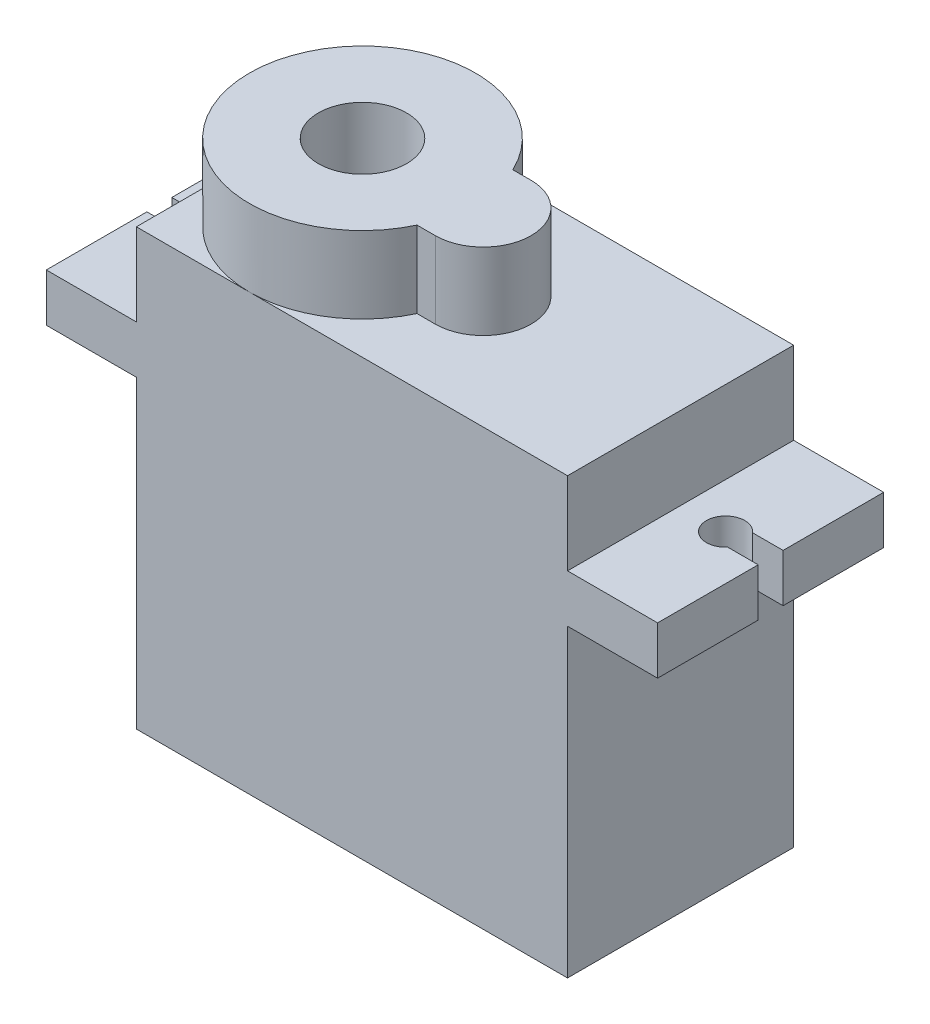
ISO-10303-21;
HEADER;
FILE_DESCRIPTION(('STEP AP214'),'2;1');
FILE_NAME('part.step','',(''),(''),'','','');
FILE_SCHEMA(('AUTOMOTIVE_DESIGN { 1 0 10303 214 1 1 1 1 }'));
ENDSEC;
DATA;
#1=APPLICATION_CONTEXT('core data for automotive mechanical design processes');
#2=APPLICATION_PROTOCOL_DEFINITION('international standard','automotive_design',2000,#1);
#3=PRODUCT_CONTEXT('',#1,'mechanical');
#4=PRODUCT('Part','Part','',(#3));
#5=PRODUCT_RELATED_PRODUCT_CATEGORY('part','',(#4));
#6=PRODUCT_DEFINITION_FORMATION('','',#4);
#7=PRODUCT_DEFINITION_CONTEXT('part definition',#1,'design');
#8=PRODUCT_DEFINITION('design','',#6,#7);
#9=PRODUCT_DEFINITION_SHAPE('','',#8);
#10=(LENGTH_UNIT() NAMED_UNIT(*) SI_UNIT(.MILLI.,.METRE.));
#11=(NAMED_UNIT(*) PLANE_ANGLE_UNIT() SI_UNIT($,.RADIAN.));
#12=(NAMED_UNIT(*) SI_UNIT($,.STERADIAN.) SOLID_ANGLE_UNIT());
#13=UNCERTAINTY_MEASURE_WITH_UNIT(LENGTH_MEASURE(1.E-05),#10,'distance_accuracy_value','');
#14=(GEOMETRIC_REPRESENTATION_CONTEXT(3) GLOBAL_UNCERTAINTY_ASSIGNED_CONTEXT((#13)) GLOBAL_UNIT_ASSIGNED_CONTEXT((#10,
#11,#12)) REPRESENTATION_CONTEXT('',''));
#15=CARTESIAN_POINT('',(0.,0.,0.));
#16=DIRECTION('',(0.,0.,1.));
#17=DIRECTION('',(1.,0.,0.));
#18=AXIS2_PLACEMENT_3D('',#15,#16,#17);
#19=CARTESIAN_POINT('',(22.5,15.9,11.8));
#20=DIRECTION('',(0.,1.,0.));
#21=DIRECTION('',(-1.,0.,0.));
#22=AXIS2_PLACEMENT_3D('',#19,#20,#21);
#23=PLANE('',#22);
#24=DIRECTION('',(1.,0.,0.));
#25=VECTOR('',#24,1.);
#26=CARTESIAN_POINT('',(22.5,15.9,5.25));
#27=LINE('',#26,#25);
#28=CARTESIAN_POINT('',(25.6099342076785,15.9,5.25));
#29=VERTEX_POINT('',#28);
#30=CARTESIAN_POINT('',(27.2,15.9,5.25));
#31=VERTEX_POINT('',#30);
#32=EDGE_CURVE('E443',#29,#31,#27,.T.);
#33=ORIENTED_EDGE('',*,*,#32,.F.);
#34=CARTESIAN_POINT('',(24.85,15.9,5.9));
#35=DIRECTION('',(0.,1.,0.));
#36=DIRECTION('',(-1.,0.,0.));
#37=AXIS2_PLACEMENT_3D('',#34,#35,#36);
#38=CIRCLE('',#37,1.);
#39=CARTESIAN_POINT('',(25.6099342076785,15.9,6.55));
#40=VERTEX_POINT('',#39);
#41=EDGE_CURVE('E442',#40,#29,#38,.F.);
#42=ORIENTED_EDGE('',*,*,#41,.F.);
#43=DIRECTION('',(-1.,0.,0.));
#44=VECTOR('',#43,1.);
#45=CARTESIAN_POINT('',(22.5,15.9,6.55));
#46=LINE('',#45,#44);
#47=CARTESIAN_POINT('',(27.2,15.9,6.55));
#48=VERTEX_POINT('',#47);
#49=EDGE_CURVE('E441',#48,#40,#46,.T.);
#50=ORIENTED_EDGE('',*,*,#49,.F.);
#51=DIRECTION('',(0.,0.,-1.));
#52=VECTOR('',#51,1.);
#53=CARTESIAN_POINT('',(27.2,15.9,11.8));
#54=LINE('',#53,#52);
#55=CARTESIAN_POINT('',(27.2,15.9,11.8));
#56=VERTEX_POINT('',#55);
#57=EDGE_CURVE('E220',#56,#48,#54,.T.);
#58=ORIENTED_EDGE('',*,*,#57,.F.);
#59=DIRECTION('',(1.,0.,0.));
#60=VECTOR('',#59,1.);
#61=CARTESIAN_POINT('',(22.5,15.9,11.8));
#62=LINE('',#61,#60);
#63=CARTESIAN_POINT('',(22.5,15.9,11.8));
#64=VERTEX_POINT('',#63);
#65=EDGE_CURVE('E322',#64,#56,#62,.T.);
#66=ORIENTED_EDGE('',*,*,#65,.F.);
#67=DIRECTION('',(0.,0.,-1.));
#68=VECTOR('',#67,1.);
#69=CARTESIAN_POINT('',(22.5,15.9,11.8));
#70=LINE('',#69,#68);
#71=CARTESIAN_POINT('',(22.5,15.9,0.));
#72=VERTEX_POINT('',#71);
#73=EDGE_CURVE('E235',#64,#72,#70,.T.);
#74=ORIENTED_EDGE('',*,*,#73,.T.);
#75=DIRECTION('',(1.,0.,0.));
#76=VECTOR('',#75,1.);
#77=CARTESIAN_POINT('',(22.5,15.9,0.));
#78=LINE('',#77,#76);
#79=CARTESIAN_POINT('',(27.2,15.9,0.));
#80=VERTEX_POINT('',#79);
#81=EDGE_CURVE('E348',#72,#80,#78,.T.);
#82=ORIENTED_EDGE('',*,*,#81,.T.);
#83=EDGE_CURVE('E227',#31,#80,#54,.T.);
#84=ORIENTED_EDGE('',*,*,#83,.F.);
#85=EDGE_LOOP('',(#33,#42,#50,#58,#66,#74,#82,#84));
#86=FACE_BOUND('',#85,.T.);
#87=ADVANCED_FACE('F32',(#86),#23,.F.);
#88=CARTESIAN_POINT('',(27.2,15.9,11.8));
#89=DIRECTION('',(-1.,0.,0.));
#90=DIRECTION('',(0.,-1.,0.));
#91=AXIS2_PLACEMENT_3D('',#88,#89,#90);
#92=PLANE('',#91);
#93=DIRECTION('',(0.,1.,0.));
#94=VECTOR('',#93,1.);
#95=CARTESIAN_POINT('',(27.2,14.4,5.25));
#96=LINE('',#95,#94);
#97=CARTESIAN_POINT('',(27.2,18.4,5.25));
#98=VERTEX_POINT('',#97);
#99=EDGE_CURVE('E221',#31,#98,#96,.T.);
#100=ORIENTED_EDGE('',*,*,#99,.F.);
#101=ORIENTED_EDGE('',*,*,#83,.T.);
#102=DIRECTION('',(0.,1.,0.));
#103=VECTOR('',#102,1.);
#104=CARTESIAN_POINT('',(27.2,15.9,0.));
#105=LINE('',#104,#103);
#106=CARTESIAN_POINT('',(27.2,18.4,0.));
#107=VERTEX_POINT('',#106);
#108=EDGE_CURVE('E351',#80,#107,#105,.T.);
#109=ORIENTED_EDGE('',*,*,#108,.T.);
#110=DIRECTION('',(0.,0.,-1.));
#111=VECTOR('',#110,1.);
#112=CARTESIAN_POINT('',(27.2,18.4,11.8));
#113=LINE('',#112,#111);
#114=EDGE_CURVE('E228',#98,#107,#113,.T.);
#115=ORIENTED_EDGE('',*,*,#114,.F.);
#116=EDGE_LOOP('',(#100,#101,#109,#115));
#117=FACE_BOUND('',#116,.T.);
#118=ADVANCED_FACE('F491',(#117),#92,.F.);
#119=DIRECTION('',(0.,1.,0.));
#120=VECTOR('',#119,1.);
#121=CARTESIAN_POINT('',(27.2,14.4,6.55));
#122=LINE('',#121,#120);
#123=CARTESIAN_POINT('',(27.2,18.4,6.55));
#124=VERTEX_POINT('',#123);
#125=EDGE_CURVE('E205',#48,#124,#122,.T.);
#126=ORIENTED_EDGE('',*,*,#125,.T.);
#127=CARTESIAN_POINT('',(27.2,18.4,11.8));
#128=VERTEX_POINT('',#127);
#129=EDGE_CURVE('E217',#128,#124,#113,.T.);
#130=ORIENTED_EDGE('',*,*,#129,.F.);
#131=DIRECTION('',(0.,1.,0.));
#132=VECTOR('',#131,1.);
#133=CARTESIAN_POINT('',(27.2,15.9,11.8));
#134=LINE('',#133,#132);
#135=EDGE_CURVE('E324',#56,#128,#134,.T.);
#136=ORIENTED_EDGE('',*,*,#135,.F.);
#137=ORIENTED_EDGE('',*,*,#57,.T.);
#138=EDGE_LOOP('',(#126,#130,#136,#137));
#139=FACE_BOUND('',#138,.T.);
#140=ADVANCED_FACE('F215',(#139),#92,.F.);
#141=CARTESIAN_POINT('',(22.5,18.4,11.8));
#142=DIRECTION('',(0.,-1.,0.));
#143=DIRECTION('',(0.,0.,-1.));
#144=AXIS2_PLACEMENT_3D('',#141,#142,#143);
#145=PLANE('',#144);
#146=DIRECTION('',(1.,0.,0.));
#147=VECTOR('',#146,1.);
#148=CARTESIAN_POINT('',(27.2,18.4,5.25));
#149=LINE('',#148,#147);
#150=CARTESIAN_POINT('',(25.6099342076785,18.4,5.25));
#151=VERTEX_POINT('',#150);
#152=EDGE_CURVE('E210',#151,#98,#149,.T.);
#153=ORIENTED_EDGE('',*,*,#152,.T.);
#154=ORIENTED_EDGE('',*,*,#114,.T.);
#155=DIRECTION('',(-1.,0.,0.));
#156=VECTOR('',#155,1.);
#157=CARTESIAN_POINT('',(22.5,18.4,0.));
#158=LINE('',#157,#156);
#159=CARTESIAN_POINT('',(22.5,18.4,0.));
#160=VERTEX_POINT('',#159);
#161=EDGE_CURVE('E354',#107,#160,#158,.T.);
#162=ORIENTED_EDGE('',*,*,#161,.T.);
#163=DIRECTION('',(0.,0.,-1.));
#164=VECTOR('',#163,1.);
#165=CARTESIAN_POINT('',(22.5,18.4,11.8));
#166=LINE('',#165,#164);
#167=CARTESIAN_POINT('',(22.5,18.4,11.8));
#168=VERTEX_POINT('',#167);
#169=EDGE_CURVE('E231',#168,#160,#166,.T.);
#170=ORIENTED_EDGE('',*,*,#169,.F.);
#171=DIRECTION('',(-1.,0.,0.));
#172=VECTOR('',#171,1.);
#173=CARTESIAN_POINT('',(22.5,18.4,11.8));
#174=LINE('',#173,#172);
#175=EDGE_CURVE('E226',#128,#168,#174,.T.);
#176=ORIENTED_EDGE('',*,*,#175,.F.);
#177=ORIENTED_EDGE('',*,*,#129,.T.);
#178=DIRECTION('',(-1.,0.,0.));
#179=VECTOR('',#178,1.);
#180=CARTESIAN_POINT('',(27.2,18.4,6.55));
#181=LINE('',#180,#179);
#182=CARTESIAN_POINT('',(25.6099342076785,18.4,6.55));
#183=VERTEX_POINT('',#182);
#184=EDGE_CURVE('E202',#124,#183,#181,.T.);
#185=ORIENTED_EDGE('',*,*,#184,.T.);
#186=CARTESIAN_POINT('',(24.85,18.4,5.9));
#187=DIRECTION('',(0.,-1.,0.));
#188=DIRECTION('',(0.,0.,1.));
#189=AXIS2_PLACEMENT_3D('',#186,#187,#188);
#190=CIRCLE('',#189,1.);
#191=EDGE_CURVE('E47',#183,#151,#190,.T.);
#192=ORIENTED_EDGE('',*,*,#191,.T.);
#193=EDGE_LOOP('',(#153,#154,#162,#170,#176,#177,#185,#192));
#194=FACE_BOUND('',#193,.T.);
#195=ADVANCED_FACE('F224',(#194),#145,.F.);
#196=CARTESIAN_POINT('',(-4.7,15.9,11.8));
#197=DIRECTION('',(1.,0.,0.));
#198=DIRECTION('',(0.,0.,-1.));
#199=AXIS2_PLACEMENT_3D('',#196,#197,#198);
#200=PLANE('',#199);
#201=DIRECTION('',(0.,0.,-1.));
#202=VECTOR('',#201,1.);
#203=CARTESIAN_POINT('',(-4.7,18.4,11.8));
#204=LINE('',#203,#202);
#205=CARTESIAN_POINT('',(-4.7,18.4,11.8));
#206=VERTEX_POINT('',#205);
#207=CARTESIAN_POINT('',(-4.7,18.4,6.55));
#208=VERTEX_POINT('',#207);
#209=EDGE_CURVE('E377',#206,#208,#204,.T.);
#210=ORIENTED_EDGE('',*,*,#209,.T.);
#211=DIRECTION('',(0.,1.,0.));
#212=VECTOR('',#211,1.);
#213=CARTESIAN_POINT('',(-4.7,14.4,6.55));
#214=LINE('',#213,#212);
#215=CARTESIAN_POINT('',(-4.7,15.9,6.55));
#216=VERTEX_POINT('',#215);
#217=EDGE_CURVE('E267',#216,#208,#214,.T.);
#218=ORIENTED_EDGE('',*,*,#217,.F.);
#219=DIRECTION('',(0.,0.,-1.));
#220=VECTOR('',#219,1.);
#221=CARTESIAN_POINT('',(-4.7,15.9,11.8));
#222=LINE('',#221,#220);
#223=CARTESIAN_POINT('',(-4.7,15.9,11.8));
#224=VERTEX_POINT('',#223);
#225=EDGE_CURVE('E374',#224,#216,#222,.T.);
#226=ORIENTED_EDGE('',*,*,#225,.F.);
#227=DIRECTION('',(0.,-1.,0.));
#228=VECTOR('',#227,1.);
#229=CARTESIAN_POINT('',(-4.7,15.9,11.8));
#230=LINE('',#229,#228);
#231=EDGE_CURVE('E337',#206,#224,#230,.T.);
#232=ORIENTED_EDGE('',*,*,#231,.F.);
#233=EDGE_LOOP('',(#210,#218,#226,#232));
#234=FACE_BOUND('',#233,.T.);
#235=ADVANCED_FACE('F474',(#234),#200,.F.);
#236=CARTESIAN_POINT('',(0.,22.7,11.8));
#237=DIRECTION('',(0.,-1.,0.));
#238=DIRECTION('',(0.,0.,-1.));
#239=AXIS2_PLACEMENT_3D('',#236,#237,#238);
#240=PLANE('',#239);
#241=CARTESIAN_POINT('',(5.9,22.7,5.9));
#242=DIRECTION('',(0.,1.,0.));
#243=DIRECTION('',(0.,0.,1.));
#244=AXIS2_PLACEMENT_3D('',#241,#242,#243);
#245=CIRCLE('',#244,5.9);
#246=CARTESIAN_POINT('',(0.,22.7,5.9));
#247=VERTEX_POINT('',#246);
#248=CARTESIAN_POINT('',(5.9,22.7,11.8));
#249=VERTEX_POINT('',#248);
#250=EDGE_CURVE('E246',#247,#249,#245,.T.);
#251=ORIENTED_EDGE('',*,*,#250,.F.);
#252=DIRECTION('',(0.,0.,-1.));
#253=VECTOR('',#252,1.);
#254=CARTESIAN_POINT('',(0.,22.7,11.8));
#255=LINE('',#254,#253);
#256=CARTESIAN_POINT('',(0.,22.7,11.8));
#257=VERTEX_POINT('',#256);
#258=EDGE_CURVE('E384',#257,#247,#255,.T.);
#259=ORIENTED_EDGE('',*,*,#258,.F.);
#260=DIRECTION('',(-1.,0.,0.));
#261=VECTOR('',#260,1.);
#262=CARTESIAN_POINT('',(0.,22.7,11.8));
#263=LINE('',#262,#261);
#264=EDGE_CURVE('E329',#249,#257,#263,.T.);
#265=ORIENTED_EDGE('',*,*,#264,.F.);
#266=EDGE_LOOP('',(#251,#259,#265));
#267=FACE_BOUND('',#266,.T.);
#268=ADVANCED_FACE('F430',(#267),#240,.F.);
#269=CARTESIAN_POINT('',(11.244155686355,22.7,8.4));
#270=VERTEX_POINT('',#269);
#271=EDGE_CURVE('E426',#249,#270,#245,.T.);
#272=ORIENTED_EDGE('',*,*,#271,.F.);
#273=CARTESIAN_POINT('',(22.5,22.7,11.8));
#274=VERTEX_POINT('',#273);
#275=EDGE_CURVE('E330',#274,#249,#263,.T.);
#276=ORIENTED_EDGE('',*,*,#275,.F.);
#277=DIRECTION('',(0.,0.,-1.));
#278=VECTOR('',#277,1.);
#279=CARTESIAN_POINT('',(22.5,22.7,11.8));
#280=LINE('',#279,#278);
#281=CARTESIAN_POINT('',(22.5,22.7,0.));
#282=VERTEX_POINT('',#281);
#283=EDGE_CURVE('E386',#274,#282,#280,.T.);
#284=ORIENTED_EDGE('',*,*,#283,.T.);
#285=DIRECTION('',(-1.,0.,0.));
#286=VECTOR('',#285,1.);
#287=CARTESIAN_POINT('',(0.,22.7,0.));
#288=LINE('',#287,#286);
#289=CARTESIAN_POINT('',(5.9,22.7,0.));
#290=VERTEX_POINT('',#289);
#291=EDGE_CURVE('E359',#282,#290,#288,.T.);
#292=ORIENTED_EDGE('',*,*,#291,.T.);
#293=CARTESIAN_POINT('',(11.244155686355,22.7,3.4));
#294=VERTEX_POINT('',#293);
#295=EDGE_CURVE('E297',#294,#290,#245,.T.);
#296=ORIENTED_EDGE('',*,*,#295,.F.);
#297=DIRECTION('',(-1.,0.,0.));
#298=VECTOR('',#297,1.);
#299=CARTESIAN_POINT('',(12.2,22.7,3.4));
#300=LINE('',#299,#298);
#301=CARTESIAN_POINT('',(12.2,22.7,3.4));
#302=VERTEX_POINT('',#301);
#303=EDGE_CURVE('E294',#302,#294,#300,.T.);
#304=ORIENTED_EDGE('',*,*,#303,.F.);
#305=CARTESIAN_POINT('',(12.2,22.7,5.9));
#306=DIRECTION('',(0.,1.,0.));
#307=DIRECTION('',(0.,0.,1.));
#308=AXIS2_PLACEMENT_3D('',#305,#306,#307);
#309=CIRCLE('',#308,2.5);
#310=CARTESIAN_POINT('',(12.2,22.7,8.4));
#311=VERTEX_POINT('',#310);
#312=EDGE_CURVE('E279',#311,#302,#309,.T.);
#313=ORIENTED_EDGE('',*,*,#312,.F.);
#314=DIRECTION('',(1.,0.,0.));
#315=VECTOR('',#314,1.);
#316=CARTESIAN_POINT('',(12.2,22.7,8.4));
#317=LINE('',#316,#315);
#318=EDGE_CURVE('E285',#270,#311,#317,.T.);
#319=ORIENTED_EDGE('',*,*,#318,.F.);
#320=EDGE_LOOP('',(#272,#276,#284,#292,#296,#304,#313,#319));
#321=FACE_BOUND('',#320,.T.);
#322=ADVANCED_FACE('F405',(#321),#240,.F.);
#323=EDGE_CURVE('E244',#290,#247,#245,.T.);
#324=ORIENTED_EDGE('',*,*,#323,.F.);
#325=CARTESIAN_POINT('',(0.,22.7,0.));
#326=VERTEX_POINT('',#325);
#327=EDGE_CURVE('E358',#290,#326,#288,.T.);
#328=ORIENTED_EDGE('',*,*,#327,.T.);
#329=EDGE_CURVE('E383',#247,#326,#255,.T.);
#330=ORIENTED_EDGE('',*,*,#329,.F.);
#331=EDGE_LOOP('',(#324,#328,#330));
#332=FACE_BOUND('',#331,.T.);
#333=ADVANCED_FACE('F479',(#332),#240,.F.);
#334=CARTESIAN_POINT('',(0.,0.,11.8));
#335=DIRECTION('',(1.,0.,0.));
#336=DIRECTION('',(0.,0.,-1.));
#337=AXIS2_PLACEMENT_3D('',#334,#335,#336);
#338=PLANE('',#337);
#339=DIRECTION('',(0.,-1.,0.));
#340=VECTOR('',#339,1.);
#341=CARTESIAN_POINT('',(0.,0.,0.));
#342=LINE('',#341,#340);
#343=CARTESIAN_POINT('',(0.,15.9,0.));
#344=VERTEX_POINT('',#343);
#345=CARTESIAN_POINT('',(0.,0.,0.));
#346=VERTEX_POINT('',#345);
#347=EDGE_CURVE('E313',#344,#346,#342,.T.);
#348=ORIENTED_EDGE('',*,*,#347,.T.);
#349=DIRECTION('',(0.,0.,-1.));
#350=VECTOR('',#349,1.);
#351=CARTESIAN_POINT('',(0.,0.,11.8));
#352=LINE('',#351,#350);
#353=CARTESIAN_POINT('',(0.,0.,11.8));
#354=VERTEX_POINT('',#353);
#355=EDGE_CURVE('E241',#354,#346,#352,.T.);
#356=ORIENTED_EDGE('',*,*,#355,.F.);
#357=DIRECTION('',(0.,-1.,0.));
#358=VECTOR('',#357,1.);
#359=CARTESIAN_POINT('',(0.,0.,11.8));
#360=LINE('',#359,#358);
#361=CARTESIAN_POINT('',(0.,15.9,11.8));
#362=VERTEX_POINT('',#361);
#363=EDGE_CURVE('E314',#362,#354,#360,.T.);
#364=ORIENTED_EDGE('',*,*,#363,.F.);
#365=DIRECTION('',(0.,0.,-1.));
#366=VECTOR('',#365,1.);
#367=CARTESIAN_POINT('',(0.,15.9,11.8));
#368=LINE('',#367,#366);
#369=EDGE_CURVE('E341',#362,#344,#368,.T.);
#370=ORIENTED_EDGE('',*,*,#369,.T.);
#371=EDGE_LOOP('',(#348,#356,#364,#370));
#372=FACE_BOUND('',#371,.T.);
#373=ADVANCED_FACE('F34',(#372),#338,.F.);
#374=CARTESIAN_POINT('',(0.,0.,11.8));
#375=DIRECTION('',(0.,1.,0.));
#376=DIRECTION('',(0.,0.,1.));
#377=AXIS2_PLACEMENT_3D('',#374,#375,#376);
#378=PLANE('',#377);
#379=DIRECTION('',(1.,0.,0.));
#380=VECTOR('',#379,1.);
#381=CARTESIAN_POINT('',(0.,0.,0.));
#382=LINE('',#381,#380);
#383=CARTESIAN_POINT('',(22.5,0.,0.));
#384=VERTEX_POINT('',#383);
#385=EDGE_CURVE('E344',#346,#384,#382,.T.);
#386=ORIENTED_EDGE('',*,*,#385,.T.);
#387=DIRECTION('',(0.,0.,-1.));
#388=VECTOR('',#387,1.);
#389=CARTESIAN_POINT('',(22.5,0.,11.8));
#390=LINE('',#389,#388);
#391=CARTESIAN_POINT('',(22.5,0.,11.8));
#392=VERTEX_POINT('',#391);
#393=EDGE_CURVE('E238',#392,#384,#390,.T.);
#394=ORIENTED_EDGE('',*,*,#393,.F.);
#395=DIRECTION('',(1.,0.,0.));
#396=VECTOR('',#395,1.);
#397=CARTESIAN_POINT('',(0.,0.,11.8));
#398=LINE('',#397,#396);
#399=EDGE_CURVE('E317',#354,#392,#398,.T.);
#400=ORIENTED_EDGE('',*,*,#399,.F.);
#401=ORIENTED_EDGE('',*,*,#355,.T.);
#402=EDGE_LOOP('',(#386,#394,#400,#401));
#403=FACE_BOUND('',#402,.T.);
#404=ADVANCED_FACE('F486',(#403),#378,.F.);
#405=CARTESIAN_POINT('',(22.5,0.,11.8));
#406=DIRECTION('',(-1.,0.,0.));
#407=DIRECTION('',(0.,0.,1.));
#408=AXIS2_PLACEMENT_3D('',#405,#406,#407);
#409=PLANE('',#408);
#410=DIRECTION('',(0.,1.,0.));
#411=VECTOR('',#410,1.);
#412=CARTESIAN_POINT('',(22.5,0.,0.));
#413=LINE('',#412,#411);
#414=EDGE_CURVE('E346',#384,#72,#413,.T.);
#415=ORIENTED_EDGE('',*,*,#414,.T.);
#416=ORIENTED_EDGE('',*,*,#73,.F.);
#417=DIRECTION('',(0.,1.,0.));
#418=VECTOR('',#417,1.);
#419=CARTESIAN_POINT('',(22.5,0.,11.8));
#420=LINE('',#419,#418);
#421=EDGE_CURVE('E320',#392,#64,#420,.T.);
#422=ORIENTED_EDGE('',*,*,#421,.F.);
#423=ORIENTED_EDGE('',*,*,#393,.T.);
#424=EDGE_LOOP('',(#415,#416,#422,#423));
#425=FACE_BOUND('',#424,.T.);
#426=ADVANCED_FACE('F500',(#425),#409,.F.);
#427=CARTESIAN_POINT('',(22.5,18.4,11.8));
#428=DIRECTION('',(-1.,0.,0.));
#429=DIRECTION('',(0.,0.,1.));
#430=AXIS2_PLACEMENT_3D('',#427,#428,#429);
#431=PLANE('',#430);
#432=DIRECTION('',(0.,1.,0.));
#433=VECTOR('',#432,1.);
#434=CARTESIAN_POINT('',(22.5,18.4,0.));
#435=LINE('',#434,#433);
#436=EDGE_CURVE('E356',#160,#282,#435,.T.);
#437=ORIENTED_EDGE('',*,*,#436,.T.);
#438=ORIENTED_EDGE('',*,*,#283,.F.);
#439=DIRECTION('',(0.,1.,0.));
#440=VECTOR('',#439,1.);
#441=CARTESIAN_POINT('',(22.5,18.4,11.8));
#442=LINE('',#441,#440);
#443=EDGE_CURVE('E327',#168,#274,#442,.T.);
#444=ORIENTED_EDGE('',*,*,#443,.F.);
#445=ORIENTED_EDGE('',*,*,#169,.T.);
#446=EDGE_LOOP('',(#437,#438,#444,#445));
#447=FACE_BOUND('',#446,.T.);
#448=ADVANCED_FACE('F396',(#447),#431,.F.);
#449=CARTESIAN_POINT('',(0.,18.4,11.8));
#450=DIRECTION('',(1.,0.,0.));
#451=DIRECTION('',(0.,0.,-1.));
#452=AXIS2_PLACEMENT_3D('',#449,#450,#451);
#453=PLANE('',#452);
#454=DIRECTION('',(0.,-1.,0.));
#455=VECTOR('',#454,1.);
#456=CARTESIAN_POINT('',(0.,18.4,0.));
#457=LINE('',#456,#455);
#458=CARTESIAN_POINT('',(0.,18.4,0.));
#459=VERTEX_POINT('',#458);
#460=EDGE_CURVE('E362',#326,#459,#457,.T.);
#461=ORIENTED_EDGE('',*,*,#460,.T.);
#462=DIRECTION('',(0.,0.,-1.));
#463=VECTOR('',#462,1.);
#464=CARTESIAN_POINT('',(0.,18.4,11.8));
#465=LINE('',#464,#463);
#466=CARTESIAN_POINT('',(0.,18.4,11.8));
#467=VERTEX_POINT('',#466);
#468=EDGE_CURVE('E380',#467,#459,#465,.T.);
#469=ORIENTED_EDGE('',*,*,#468,.F.);
#470=DIRECTION('',(0.,-1.,0.));
#471=VECTOR('',#470,1.);
#472=CARTESIAN_POINT('',(0.,18.4,11.8));
#473=LINE('',#472,#471);
#474=EDGE_CURVE('E333',#257,#467,#473,.T.);
#475=ORIENTED_EDGE('',*,*,#474,.F.);
#476=ORIENTED_EDGE('',*,*,#258,.T.);
#477=ORIENTED_EDGE('',*,*,#329,.T.);
#478=EDGE_LOOP('',(#461,#469,#475,#476,#477));
#479=FACE_BOUND('',#478,.T.);
#480=ADVANCED_FACE('F477',(#479),#453,.F.);
#481=CARTESIAN_POINT('',(-4.7,18.4,11.8));
#482=DIRECTION('',(0.,-1.,0.));
#483=DIRECTION('',(0.,0.,-1.));
#484=AXIS2_PLACEMENT_3D('',#481,#482,#483);
#485=PLANE('',#484);
#486=CARTESIAN_POINT('',(-2.35,18.4,5.9));
#487=DIRECTION('',(0.,1.,0.));
#488=DIRECTION('',(0.,0.,1.));
#489=AXIS2_PLACEMENT_3D('',#486,#487,#488);
#490=CIRCLE('',#489,1.);
#491=CARTESIAN_POINT('',(-3.10993420767853,18.4,6.55));
#492=VERTEX_POINT('',#491);
#493=CARTESIAN_POINT('',(-3.10993420767853,18.4,5.25));
#494=VERTEX_POINT('',#493);
#495=EDGE_CURVE('E451',#492,#494,#490,.T.);
#496=ORIENTED_EDGE('',*,*,#495,.F.);
#497=DIRECTION('',(1.,0.,0.));
#498=VECTOR('',#497,1.);
#499=CARTESIAN_POINT('',(-4.7,18.4,6.55));
#500=LINE('',#499,#498);
#501=EDGE_CURVE('E264',#208,#492,#500,.T.);
#502=ORIENTED_EDGE('',*,*,#501,.F.);
#503=ORIENTED_EDGE('',*,*,#209,.F.);
#504=DIRECTION('',(-1.,0.,0.));
#505=VECTOR('',#504,1.);
#506=CARTESIAN_POINT('',(-4.7,18.4,11.8));
#507=LINE('',#506,#505);
#508=EDGE_CURVE('E335',#467,#206,#507,.T.);
#509=ORIENTED_EDGE('',*,*,#508,.F.);
#510=ORIENTED_EDGE('',*,*,#468,.T.);
#511=DIRECTION('',(-1.,0.,0.));
#512=VECTOR('',#511,1.);
#513=CARTESIAN_POINT('',(-4.7,18.4,0.));
#514=LINE('',#513,#512);
#515=CARTESIAN_POINT('',(-4.7,18.4,0.));
#516=VERTEX_POINT('',#515);
#517=EDGE_CURVE('E364',#459,#516,#514,.T.);
#518=ORIENTED_EDGE('',*,*,#517,.T.);
#519=CARTESIAN_POINT('',(-4.7,18.4,5.25));
#520=VERTEX_POINT('',#519);
#521=EDGE_CURVE('E376',#520,#516,#204,.T.);
#522=ORIENTED_EDGE('',*,*,#521,.F.);
#523=DIRECTION('',(-1.,0.,0.));
#524=VECTOR('',#523,1.);
#525=CARTESIAN_POINT('',(-4.7,18.4,5.25));
#526=LINE('',#525,#524);
#527=EDGE_CURVE('E452',#494,#520,#526,.T.);
#528=ORIENTED_EDGE('',*,*,#527,.F.);
#529=EDGE_LOOP('',(#496,#502,#503,#509,#510,#518,#522,#528));
#530=FACE_BOUND('',#529,.T.);
#531=ADVANCED_FACE('F459',(#530),#485,.F.);
#532=CARTESIAN_POINT('',(-4.7,15.9,5.25));
#533=VERTEX_POINT('',#532);
#534=CARTESIAN_POINT('',(-4.7,15.9,0.));
#535=VERTEX_POINT('',#534);
#536=EDGE_CURVE('E373',#533,#535,#222,.T.);
#537=ORIENTED_EDGE('',*,*,#536,.F.);
#538=DIRECTION('',(0.,1.,0.));
#539=VECTOR('',#538,1.);
#540=CARTESIAN_POINT('',(-4.7,14.4,5.25));
#541=LINE('',#540,#539);
#542=EDGE_CURVE('E55',#533,#520,#541,.T.);
#543=ORIENTED_EDGE('',*,*,#542,.T.);
#544=ORIENTED_EDGE('',*,*,#521,.T.);
#545=DIRECTION('',(0.,-1.,0.));
#546=VECTOR('',#545,1.);
#547=CARTESIAN_POINT('',(-4.7,15.9,0.));
#548=LINE('',#547,#546);
#549=EDGE_CURVE('E367',#516,#535,#548,.T.);
#550=ORIENTED_EDGE('',*,*,#549,.T.);
#551=EDGE_LOOP('',(#537,#543,#544,#550));
#552=FACE_BOUND('',#551,.T.);
#553=ADVANCED_FACE('F458',(#552),#200,.F.);
#554=CARTESIAN_POINT('',(-4.7,15.9,11.8));
#555=DIRECTION('',(0.,1.,0.));
#556=DIRECTION('',(0.,0.,1.));
#557=AXIS2_PLACEMENT_3D('',#554,#555,#556);
#558=PLANE('',#557);
#559=ORIENTED_EDGE('',*,*,#225,.T.);
#560=DIRECTION('',(1.,0.,0.));
#561=VECTOR('',#560,1.);
#562=CARTESIAN_POINT('',(-4.7,15.9,6.55));
#563=LINE('',#562,#561);
#564=CARTESIAN_POINT('',(-3.10993420767853,15.9,6.55));
#565=VERTEX_POINT('',#564);
#566=EDGE_CURVE('E11',#216,#565,#563,.T.);
#567=ORIENTED_EDGE('',*,*,#566,.T.);
#568=CARTESIAN_POINT('',(-2.35,15.9,5.9));
#569=DIRECTION('',(0.,1.,0.));
#570=DIRECTION('',(0.,0.,1.));
#571=AXIS2_PLACEMENT_3D('',#568,#569,#570);
#572=CIRCLE('',#571,1.);
#573=CARTESIAN_POINT('',(-3.10993420767853,15.9,5.25));
#574=VERTEX_POINT('',#573);
#575=EDGE_CURVE('E40',#565,#574,#572,.T.);
#576=ORIENTED_EDGE('',*,*,#575,.T.);
#577=DIRECTION('',(-1.,0.,0.));
#578=VECTOR('',#577,1.);
#579=CARTESIAN_POINT('',(-4.7,15.9,5.25));
#580=LINE('',#579,#578);
#581=EDGE_CURVE('E245',#574,#533,#580,.T.);
#582=ORIENTED_EDGE('',*,*,#581,.T.);
#583=ORIENTED_EDGE('',*,*,#536,.T.);
#584=DIRECTION('',(1.,0.,0.));
#585=VECTOR('',#584,1.);
#586=CARTESIAN_POINT('',(-4.7,15.9,0.));
#587=LINE('',#586,#585);
#588=EDGE_CURVE('E318',#535,#344,#587,.T.);
#589=ORIENTED_EDGE('',*,*,#588,.T.);
#590=ORIENTED_EDGE('',*,*,#369,.F.);
#591=DIRECTION('',(1.,0.,0.));
#592=VECTOR('',#591,1.);
#593=CARTESIAN_POINT('',(-4.7,15.9,11.8));
#594=LINE('',#593,#592);
#595=EDGE_CURVE('E339',#224,#362,#594,.T.);
#596=ORIENTED_EDGE('',*,*,#595,.F.);
#597=EDGE_LOOP('',(#559,#567,#576,#582,#583,#589,#590,#596));
#598=FACE_BOUND('',#597,.T.);
#599=ADVANCED_FACE('F250',(#598),#558,.F.);
#600=CARTESIAN_POINT('',(0.,0.,11.8));
#601=DIRECTION('',(0.,0.,-1.));
#602=DIRECTION('',(-1.,0.,0.));
#603=AXIS2_PLACEMENT_3D('',#600,#601,#602);
#604=PLANE('',#603);
#605=ORIENTED_EDGE('',*,*,#363,.T.);
#606=ORIENTED_EDGE('',*,*,#399,.T.);
#607=ORIENTED_EDGE('',*,*,#421,.T.);
#608=ORIENTED_EDGE('',*,*,#65,.T.);
#609=ORIENTED_EDGE('',*,*,#135,.T.);
#610=ORIENTED_EDGE('',*,*,#175,.T.);
#611=ORIENTED_EDGE('',*,*,#443,.T.);
#612=ORIENTED_EDGE('',*,*,#275,.T.);
#613=ORIENTED_EDGE('',*,*,#264,.T.);
#614=ORIENTED_EDGE('',*,*,#474,.T.);
#615=ORIENTED_EDGE('',*,*,#508,.T.);
#616=ORIENTED_EDGE('',*,*,#231,.T.);
#617=ORIENTED_EDGE('',*,*,#595,.T.);
#618=EDGE_LOOP('',(#605,#606,#607,#608,#609,#610,#611,#612,#613,#614,#615,#616,#617));
#619=FACE_BOUND('',#618,.T.);
#620=ADVANCED_FACE('F434',(#619),#604,.F.);
#621=CARTESIAN_POINT('',(0.,0.,0.));
#622=DIRECTION('',(0.,0.,-1.));
#623=DIRECTION('',(-1.,0.,0.));
#624=AXIS2_PLACEMENT_3D('',#621,#622,#623);
#625=PLANE('',#624);
#626=ORIENTED_EDGE('',*,*,#347,.F.);
#627=ORIENTED_EDGE('',*,*,#588,.F.);
#628=ORIENTED_EDGE('',*,*,#549,.F.);
#629=ORIENTED_EDGE('',*,*,#517,.F.);
#630=ORIENTED_EDGE('',*,*,#460,.F.);
#631=ORIENTED_EDGE('',*,*,#327,.F.);
#632=ORIENTED_EDGE('',*,*,#291,.F.);
#633=ORIENTED_EDGE('',*,*,#436,.F.);
#634=ORIENTED_EDGE('',*,*,#161,.F.);
#635=ORIENTED_EDGE('',*,*,#108,.F.);
#636=ORIENTED_EDGE('',*,*,#81,.F.);
#637=ORIENTED_EDGE('',*,*,#414,.F.);
#638=ORIENTED_EDGE('',*,*,#385,.F.);
#639=EDGE_LOOP('',(#626,#627,#628,#629,#630,#631,#632,#633,#634,#635,#636,#637,#638));
#640=FACE_BOUND('',#639,.T.);
#641=ADVANCED_FACE('F400',(#640),#625,.T.);
#642=CARTESIAN_POINT('',(12.2,26.7,5.9));
#643=DIRECTION('',(0.,-1.,0.));
#644=DIRECTION('',(0.,0.,-1.));
#645=AXIS2_PLACEMENT_3D('',#642,#643,#644);
#646=CYLINDRICAL_SURFACE('',#645,2.5);
#647=ORIENTED_EDGE('',*,*,#312,.T.);
#648=DIRECTION('',(0.,-1.,0.));
#649=VECTOR('',#648,1.);
#650=CARTESIAN_POINT('',(12.2,26.7,3.4));
#651=LINE('',#650,#649);
#652=CARTESIAN_POINT('',(12.2,26.7,3.4));
#653=VERTEX_POINT('',#652);
#654=EDGE_CURVE('E310',#653,#302,#651,.T.);
#655=ORIENTED_EDGE('',*,*,#654,.F.);
#656=CARTESIAN_POINT('',(12.2,26.7,5.9));
#657=DIRECTION('',(0.,1.,0.));
#658=DIRECTION('',(0.,0.,1.));
#659=AXIS2_PLACEMENT_3D('',#656,#657,#658);
#660=CIRCLE('',#659,2.5);
#661=CARTESIAN_POINT('',(12.2,26.7,8.4));
#662=VERTEX_POINT('',#661);
#663=EDGE_CURVE('E281',#662,#653,#660,.T.);
#664=ORIENTED_EDGE('',*,*,#663,.F.);
#665=DIRECTION('',(0.,-1.,0.));
#666=VECTOR('',#665,1.);
#667=CARTESIAN_POINT('',(12.2,26.7,8.4));
#668=LINE('',#667,#666);
#669=EDGE_CURVE('E291',#662,#311,#668,.T.);
#670=ORIENTED_EDGE('',*,*,#669,.T.);
#671=EDGE_LOOP('',(#647,#655,#664,#670));
#672=FACE_BOUND('',#671,.T.);
#673=ADVANCED_FACE('F423',(#672),#646,.T.);
#674=CARTESIAN_POINT('',(12.2,26.7,3.4));
#675=DIRECTION('',(0.,0.,1.));
#676=DIRECTION('',(1.,0.,0.));
#677=AXIS2_PLACEMENT_3D('',#674,#675,#676);
#678=PLANE('',#677);
#679=ORIENTED_EDGE('',*,*,#303,.T.);
#680=DIRECTION('',(0.,-1.,0.));
#681=VECTOR('',#680,1.);
#682=CARTESIAN_POINT('',(11.244155686355,26.7,3.4));
#683=LINE('',#682,#681);
#684=CARTESIAN_POINT('',(11.244155686355,26.7,3.4));
#685=VERTEX_POINT('',#684);
#686=EDGE_CURVE('E307',#685,#294,#683,.T.);
#687=ORIENTED_EDGE('',*,*,#686,.F.);
#688=DIRECTION('',(-1.,0.,0.));
#689=VECTOR('',#688,1.);
#690=CARTESIAN_POINT('',(12.2,26.7,3.4));
#691=LINE('',#690,#689);
#692=EDGE_CURVE('E284',#653,#685,#691,.T.);
#693=ORIENTED_EDGE('',*,*,#692,.F.);
#694=ORIENTED_EDGE('',*,*,#654,.T.);
#695=EDGE_LOOP('',(#679,#687,#693,#694));
#696=FACE_BOUND('',#695,.T.);
#697=ADVANCED_FACE('F414',(#696),#678,.F.);
#698=CARTESIAN_POINT('',(5.9,26.7,5.9));
#699=DIRECTION('',(0.,-1.,0.));
#700=DIRECTION('',(0.,0.,-1.));
#701=AXIS2_PLACEMENT_3D('',#698,#699,#700);
#702=CYLINDRICAL_SURFACE('',#701,5.9);
#703=ORIENTED_EDGE('',*,*,#295,.T.);
#704=ORIENTED_EDGE('',*,*,#323,.T.);
#705=ORIENTED_EDGE('',*,*,#250,.T.);
#706=ORIENTED_EDGE('',*,*,#271,.T.);
#707=DIRECTION('',(0.,-1.,0.));
#708=VECTOR('',#707,1.);
#709=CARTESIAN_POINT('',(11.244155686355,26.7,8.4));
#710=LINE('',#709,#708);
#711=CARTESIAN_POINT('',(11.244155686355,26.7,8.4));
#712=VERTEX_POINT('',#711);
#713=EDGE_CURVE('E304',#712,#270,#710,.T.);
#714=ORIENTED_EDGE('',*,*,#713,.F.);
#715=CARTESIAN_POINT('',(5.9,26.7,5.9));
#716=DIRECTION('',(0.,1.,0.));
#717=DIRECTION('',(0.,0.,1.));
#718=AXIS2_PLACEMENT_3D('',#715,#716,#717);
#719=CIRCLE('',#718,5.9);
#720=EDGE_CURVE('E287',#685,#712,#719,.T.);
#721=ORIENTED_EDGE('',*,*,#720,.F.);
#722=ORIENTED_EDGE('',*,*,#686,.T.);
#723=EDGE_LOOP('',(#703,#704,#705,#706,#714,#721,#722));
#724=FACE_BOUND('',#723,.T.);
#725=ADVANCED_FACE('F408',(#724),#702,.T.);
#726=CARTESIAN_POINT('',(12.2,26.7,8.4));
#727=DIRECTION('',(0.,0.,-1.));
#728=DIRECTION('',(-1.,0.,0.));
#729=AXIS2_PLACEMENT_3D('',#726,#727,#728);
#730=PLANE('',#729);
#731=ORIENTED_EDGE('',*,*,#318,.T.);
#732=ORIENTED_EDGE('',*,*,#669,.F.);
#733=DIRECTION('',(1.,0.,0.));
#734=VECTOR('',#733,1.);
#735=CARTESIAN_POINT('',(12.2,26.7,8.4));
#736=LINE('',#735,#734);
#737=EDGE_CURVE('E289',#712,#662,#736,.T.);
#738=ORIENTED_EDGE('',*,*,#737,.F.);
#739=ORIENTED_EDGE('',*,*,#713,.T.);
#740=EDGE_LOOP('',(#731,#732,#738,#739));
#741=FACE_BOUND('',#740,.T.);
#742=ADVANCED_FACE('F420',(#741),#730,.F.);
#743=CARTESIAN_POINT('',(12.2,26.7,5.9));
#744=DIRECTION('',(0.,1.,0.));
#745=DIRECTION('',(0.,0.,1.));
#746=AXIS2_PLACEMENT_3D('',#743,#744,#745);
#747=PLANE('',#746);
#748=CARTESIAN_POINT('',(5.9,26.7,5.9));
#749=DIRECTION('',(0.,1.,0.));
#750=DIRECTION('',(0.,0.,1.));
#751=AXIS2_PLACEMENT_3D('',#748,#749,#750);
#752=CIRCLE('',#751,2.3);
#753=CARTESIAN_POINT('',(5.9,26.7,8.2));
#754=VERTEX_POINT('',#753);
#755=EDGE_CURVE('E266',#754,#754,#752,.T.);
#756=ORIENTED_EDGE('',*,*,#755,.F.);
#757=EDGE_LOOP('',(#756));
#758=FACE_BOUND('',#757,.T.);
#759=ORIENTED_EDGE('',*,*,#663,.T.);
#760=ORIENTED_EDGE('',*,*,#692,.T.);
#761=ORIENTED_EDGE('',*,*,#720,.T.);
#762=ORIENTED_EDGE('',*,*,#737,.T.);
#763=EDGE_LOOP('',(#759,#760,#761,#762));
#764=FACE_BOUND('',#763,.T.);
#765=ADVANCED_FACE('F425',(#758,#764),#747,.T.);
#766=CARTESIAN_POINT('',(5.9,22.7,5.9));
#767=DIRECTION('',(0.,1.,0.));
#768=DIRECTION('',(0.,0.,1.));
#769=AXIS2_PLACEMENT_3D('',#766,#767,#768);
#770=CYLINDRICAL_SURFACE('',#769,2.3);
#771=CARTESIAN_POINT('',(5.9,22.7,5.9));
#772=DIRECTION('',(0.,1.,0.));
#773=DIRECTION('',(0.,0.,1.));
#774=AXIS2_PLACEMENT_3D('',#771,#772,#773);
#775=CIRCLE('',#774,2.3);
#776=CARTESIAN_POINT('',(5.9,22.7,8.2));
#777=VERTEX_POINT('',#776);
#778=EDGE_CURVE('E270',#777,#777,#775,.T.);
#779=ORIENTED_EDGE('',*,*,#778,.F.);
#780=EDGE_LOOP('',(#779));
#781=FACE_BOUND('',#780,.T.);
#782=ORIENTED_EDGE('',*,*,#755,.T.);
#783=EDGE_LOOP('',(#782));
#784=FACE_BOUND('',#783,.T.);
#785=ADVANCED_FACE('F537',(#781,#784),#770,.F.);
#786=CARTESIAN_POINT('',(5.9,22.7,5.9));
#787=DIRECTION('',(0.,1.,0.));
#788=DIRECTION('',(0.,0.,1.));
#789=AXIS2_PLACEMENT_3D('',#786,#787,#788);
#790=PLANE('',#789);
#791=ORIENTED_EDGE('',*,*,#778,.T.);
#792=EDGE_LOOP('',(#791));
#793=FACE_BOUND('',#792,.T.);
#794=ADVANCED_FACE('F534',(#793),#790,.T.);
#795=CARTESIAN_POINT('',(-2.35,14.4,5.9));
#796=DIRECTION('',(0.,1.,0.));
#797=DIRECTION('',(0.,0.,1.));
#798=AXIS2_PLACEMENT_3D('',#795,#796,#797);
#799=CYLINDRICAL_SURFACE('',#798,1.);
#800=DIRECTION('',(0.,1.,0.));
#801=VECTOR('',#800,1.);
#802=CARTESIAN_POINT('',(-3.10993420767853,14.4,6.55));
#803=LINE('',#802,#801);
#804=EDGE_CURVE('E257',#565,#492,#803,.T.);
#805=ORIENTED_EDGE('',*,*,#804,.T.);
#806=ORIENTED_EDGE('',*,*,#495,.T.);
#807=DIRECTION('',(0.,1.,0.));
#808=VECTOR('',#807,1.);
#809=CARTESIAN_POINT('',(-3.10993420767853,14.4,5.25));
#810=LINE('',#809,#808);
#811=EDGE_CURVE('E259',#574,#494,#810,.T.);
#812=ORIENTED_EDGE('',*,*,#811,.F.);
#813=ORIENTED_EDGE('',*,*,#575,.F.);
#814=EDGE_LOOP('',(#805,#806,#812,#813));
#815=FACE_BOUND('',#814,.T.);
#816=ADVANCED_FACE('F255',(#815),#799,.F.);
#817=CARTESIAN_POINT('',(-4.7,14.4,6.55));
#818=DIRECTION('',(0.,0.,1.));
#819=DIRECTION('',(1.,0.,0.));
#820=AXIS2_PLACEMENT_3D('',#817,#818,#819);
#821=PLANE('',#820);
#822=ORIENTED_EDGE('',*,*,#217,.T.);
#823=ORIENTED_EDGE('',*,*,#501,.T.);
#824=ORIENTED_EDGE('',*,*,#804,.F.);
#825=ORIENTED_EDGE('',*,*,#566,.F.);
#826=EDGE_LOOP('',(#822,#823,#824,#825));
#827=FACE_BOUND('',#826,.T.);
#828=ADVANCED_FACE('F261',(#827),#821,.F.);
#829=CARTESIAN_POINT('',(-4.7,14.4,5.25));
#830=DIRECTION('',(0.,0.,-1.));
#831=DIRECTION('',(-1.,0.,0.));
#832=AXIS2_PLACEMENT_3D('',#829,#830,#831);
#833=PLANE('',#832);
#834=ORIENTED_EDGE('',*,*,#811,.T.);
#835=ORIENTED_EDGE('',*,*,#527,.T.);
#836=ORIENTED_EDGE('',*,*,#542,.F.);
#837=ORIENTED_EDGE('',*,*,#581,.F.);
#838=EDGE_LOOP('',(#834,#835,#836,#837));
#839=FACE_BOUND('',#838,.T.);
#840=ADVANCED_FACE('F454',(#839),#833,.F.);
#841=CARTESIAN_POINT('',(24.85,14.4,5.9));
#842=DIRECTION('',(0.,1.,0.));
#843=DIRECTION('',(0.,0.,1.));
#844=AXIS2_PLACEMENT_3D('',#841,#842,#843);
#845=CYLINDRICAL_SURFACE('',#844,1.);
#846=ORIENTED_EDGE('',*,*,#41,.T.);
#847=DIRECTION('',(0.,1.,0.));
#848=VECTOR('',#847,1.);
#849=CARTESIAN_POINT('',(25.6099342076785,14.4,5.25));
#850=LINE('',#849,#848);
#851=EDGE_CURVE('E444',#29,#151,#850,.T.);
#852=ORIENTED_EDGE('',*,*,#851,.T.);
#853=ORIENTED_EDGE('',*,*,#191,.F.);
#854=DIRECTION('',(0.,1.,0.));
#855=VECTOR('',#854,1.);
#856=CARTESIAN_POINT('',(25.6099342076785,14.4,6.55));
#857=LINE('',#856,#855);
#858=EDGE_CURVE('E207',#40,#183,#857,.T.);
#859=ORIENTED_EDGE('',*,*,#858,.F.);
#860=EDGE_LOOP('',(#846,#852,#853,#859));
#861=FACE_BOUND('',#860,.T.);
#862=ADVANCED_FACE('F519',(#861),#845,.F.);
#863=CARTESIAN_POINT('',(27.2,14.4,5.25));
#864=DIRECTION('',(0.,0.,1.));
#865=DIRECTION('',(1.,0.,0.));
#866=AXIS2_PLACEMENT_3D('',#863,#864,#865);
#867=PLANE('',#866);
#868=ORIENTED_EDGE('',*,*,#32,.T.);
#869=ORIENTED_EDGE('',*,*,#99,.T.);
#870=ORIENTED_EDGE('',*,*,#152,.F.);
#871=ORIENTED_EDGE('',*,*,#851,.F.);
#872=EDGE_LOOP('',(#868,#869,#870,#871));
#873=FACE_BOUND('',#872,.T.);
#874=ADVANCED_FACE('F518',(#873),#867,.T.);
#875=CARTESIAN_POINT('',(27.2,14.4,6.55));
#876=DIRECTION('',(0.,0.,-1.));
#877=DIRECTION('',(-1.,0.,0.));
#878=AXIS2_PLACEMENT_3D('',#875,#876,#877);
#879=PLANE('',#878);
#880=ORIENTED_EDGE('',*,*,#49,.T.);
#881=ORIENTED_EDGE('',*,*,#858,.T.);
#882=ORIENTED_EDGE('',*,*,#184,.F.);
#883=ORIENTED_EDGE('',*,*,#125,.F.);
#884=EDGE_LOOP('',(#880,#881,#882,#883));
#885=FACE_BOUND('',#884,.T.);
#886=ADVANCED_FACE('F204',(#885),#879,.T.);
#887=CLOSED_SHELL('',(#87,#118,#140,#195,#235,#268,#322,#333,#373,#404,#426,#448,#480,#531,#553,
#599,#620,#641,#673,#697,#725,#742,#765,#785,#794,#816,#828,#840,#862,#874,#886));
#888=MANIFOLD_SOLID_BREP('B2',#887);
#889=ADVANCED_BREP_SHAPE_REPRESENTATION('',(#18,#888),#14);
#890=SHAPE_DEFINITION_REPRESENTATION(#9,#889);
ENDSEC;
END-ISO-10303-21;
